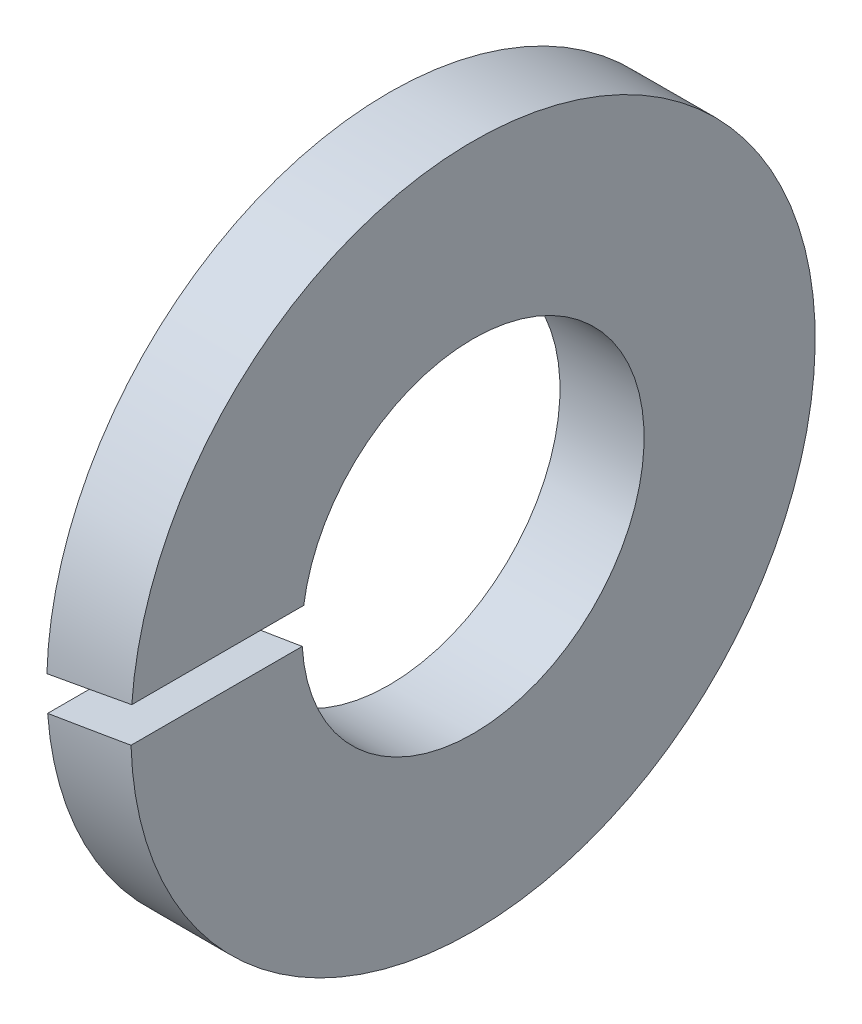
ISO-10303-21;
HEADER;
FILE_DESCRIPTION(('STEP AP214'),'2;1');
FILE_NAME('part.step','',(''),(''),'','','');
FILE_SCHEMA(('AUTOMOTIVE_DESIGN { 1 0 10303 214 1 1 1 1 }'));
ENDSEC;
DATA;
#1=APPLICATION_CONTEXT('core data for automotive mechanical design processes');
#2=APPLICATION_PROTOCOL_DEFINITION('international standard','automotive_design',2000,#1);
#3=PRODUCT_CONTEXT('',#1,'mechanical');
#4=PRODUCT('Part','Part','',(#3));
#5=PRODUCT_RELATED_PRODUCT_CATEGORY('part','',(#4));
#6=PRODUCT_DEFINITION_FORMATION('','',#4);
#7=PRODUCT_DEFINITION_CONTEXT('part definition',#1,'design');
#8=PRODUCT_DEFINITION('design','',#6,#7);
#9=PRODUCT_DEFINITION_SHAPE('','',#8);
#10=(LENGTH_UNIT() NAMED_UNIT(*) SI_UNIT(.MILLI.,.METRE.));
#11=(NAMED_UNIT(*) PLANE_ANGLE_UNIT() SI_UNIT($,.RADIAN.));
#12=(NAMED_UNIT(*) SI_UNIT($,.STERADIAN.) SOLID_ANGLE_UNIT());
#13=UNCERTAINTY_MEASURE_WITH_UNIT(LENGTH_MEASURE(1.E-05),#10,'distance_accuracy_value','');
#14=(GEOMETRIC_REPRESENTATION_CONTEXT(3) GLOBAL_UNCERTAINTY_ASSIGNED_CONTEXT((#13)) GLOBAL_UNIT_ASSIGNED_CONTEXT((#10,
#11,#12)) REPRESENTATION_CONTEXT('',''));
#15=CARTESIAN_POINT('',(0.,0.,0.));
#16=DIRECTION('',(0.,0.,1.));
#17=DIRECTION('',(1.,0.,0.));
#18=AXIS2_PLACEMENT_3D('',#15,#16,#17);
#19=CARTESIAN_POINT('',(-0.75,4.575,0.));
#20=DIRECTION('',(-1.,0.,0.));
#21=DIRECTION('',(0.,0.,1.));
#22=AXIS2_PLACEMENT_3D('',#19,#20,#21);
#23=PLANE('',#22);
#24=DIRECTION('',(0.,0.,1.));
#25=VECTOR('',#24,1.);
#26=CARTESIAN_POINT('',(-0.750000000000001,-0.441950352156501,0.));
#27=LINE('',#26,#25);
#28=CARTESIAN_POINT('',(-0.75,-0.441950352156501,6.08396908984823));
#29=VERTEX_POINT('',#28);
#30=CARTESIAN_POINT('',(-0.75,-0.441950352156501,3.01781044570873));
#31=VERTEX_POINT('',#30);
#32=EDGE_CURVE('E52',#29,#31,#27,.F.);
#33=ORIENTED_EDGE('',*,*,#32,.T.);
#34=CARTESIAN_POINT('',(-0.75,0.,0.));
#35=DIRECTION('',(1.,0.,0.));
#36=DIRECTION('',(0.,0.,-1.));
#37=AXIS2_PLACEMENT_3D('',#34,#35,#36);
#38=CIRCLE('',#37,3.05);
#39=CARTESIAN_POINT('',(-0.75,0.177459881093804,3.04483299880341));
#40=VERTEX_POINT('',#39);
#41=EDGE_CURVE('E19',#31,#40,#38,.T.);
#42=ORIENTED_EDGE('',*,*,#41,.T.);
#43=DIRECTION('',(0.,0.,1.));
#44=VECTOR('',#43,1.);
#45=CARTESIAN_POINT('',(-0.75,0.177459881093804,0.));
#46=LINE('',#45,#44);
#47=CARTESIAN_POINT('',(-0.75,0.177459881093804,6.09741814136132));
#48=VERTEX_POINT('',#47);
#49=EDGE_CURVE('E56',#40,#48,#46,.T.);
#50=ORIENTED_EDGE('',*,*,#49,.T.);
#51=CARTESIAN_POINT('',(-0.75,0.,0.));
#52=DIRECTION('',(1.,0.,0.));
#53=DIRECTION('',(0.,0.,-1.));
#54=AXIS2_PLACEMENT_3D('',#51,#52,#53);
#55=CIRCLE('',#54,6.1);
#56=EDGE_CURVE('E80',#29,#48,#55,.T.);
#57=ORIENTED_EDGE('',*,*,#56,.F.);
#58=EDGE_LOOP('',(#33,#42,#50,#57));
#59=FACE_BOUND('',#58,.T.);
#60=ADVANCED_FACE('F16',(#59),#23,.T.);
#61=CARTESIAN_POINT('',(-1.53017432370673,0.039894098168328,0.));
#62=DIRECTION('',(-0.17364817766693,0.984807753012208,0.));
#63=DIRECTION('',(-0.984807753012208,-0.17364817766693,0.));
#64=AXIS2_PLACEMENT_3D('',#61,#62,#63);
#65=PLANE('',#64);
#66=CARTESIAN_POINT('',(-1.75642499735881,0.,0.));
#67=DIRECTION('',(-0.17364817766693,0.984807753012208,0.));
#68=DIRECTION('',(0.984807753012208,0.17364817766693,0.));
#69=AXIS2_PLACEMENT_3D('',#66,#67,#68);
#70=ELLIPSE('',#69,35.1284999471762,6.1);
#71=CARTESIAN_POINT('',(0.75,0.441950352156501,6.08396908984823));
#72=VERTEX_POINT('',#71);
#73=EDGE_CURVE('E68',#48,#72,#70,.T.);
#74=ORIENTED_EDGE('',*,*,#73,.F.);
#75=ORIENTED_EDGE('',*,*,#49,.F.);
#76=CARTESIAN_POINT('',(-1.75642499735881,0.,0.));
#77=DIRECTION('',(-0.17364817766693,0.984807753012208,0.));
#78=DIRECTION('',(0.984807753012208,0.17364817766693,0.));
#79=AXIS2_PLACEMENT_3D('',#76,#77,#78);
#80=ELLIPSE('',#79,17.5642499735881,3.05);
#81=CARTESIAN_POINT('',(0.75,0.441950352156501,3.01781044570873));
#82=VERTEX_POINT('',#81);
#83=EDGE_CURVE('E62',#40,#82,#80,.T.);
#84=ORIENTED_EDGE('',*,*,#83,.T.);
#85=DIRECTION('',(0.,0.,-1.));
#86=VECTOR('',#85,1.);
#87=CARTESIAN_POINT('',(0.75,0.441950352156501,0.));
#88=LINE('',#87,#86);
#89=EDGE_CURVE('E84',#72,#82,#88,.T.);
#90=ORIENTED_EDGE('',*,*,#89,.F.);
#91=EDGE_LOOP('',(#74,#75,#84,#90));
#92=FACE_BOUND('',#91,.T.);
#93=ADVANCED_FACE('F64',(#92),#65,.F.);
#94=CARTESIAN_POINT('',(0.,0.,0.));
#95=DIRECTION('',(1.,0.,0.));
#96=DIRECTION('',(0.,0.,-1.));
#97=AXIS2_PLACEMENT_3D('',#94,#95,#96);
#98=CYLINDRICAL_SURFACE('',#97,3.05);
#99=ORIENTED_EDGE('',*,*,#83,.F.);
#100=ORIENTED_EDGE('',*,*,#41,.F.);
#101=CARTESIAN_POINT('',(1.75642499735881,0.,0.));
#102=DIRECTION('',(0.17364817766693,-0.984807753012208,0.));
#103=DIRECTION('',(0.984807753012208,0.17364817766693,0.));
#104=AXIS2_PLACEMENT_3D('',#101,#102,#103);
#105=ELLIPSE('',#104,17.5642499735881,3.05);
#106=CARTESIAN_POINT('',(0.75,-0.177459881093804,3.04483299880341));
#107=VERTEX_POINT('',#106);
#108=EDGE_CURVE('E75',#31,#107,#105,.F.);
#109=ORIENTED_EDGE('',*,*,#108,.T.);
#110=CARTESIAN_POINT('',(0.75,0.,0.));
#111=DIRECTION('',(1.,0.,0.));
#112=DIRECTION('',(0.,0.,-1.));
#113=AXIS2_PLACEMENT_3D('',#110,#111,#112);
#114=CIRCLE('',#113,3.05);
#115=EDGE_CURVE('E73',#82,#107,#114,.F.);
#116=ORIENTED_EDGE('',*,*,#115,.F.);
#117=EDGE_LOOP('',(#99,#100,#109,#116));
#118=FACE_BOUND('',#117,.T.);
#119=ADVANCED_FACE('F71',(#118),#98,.F.);
#120=CARTESIAN_POINT('',(1.53017432370673,-0.039894098168328,0.));
#121=DIRECTION('',(0.17364817766693,-0.984807753012208,0.));
#122=DIRECTION('',(0.984807753012208,0.17364817766693,0.));
#123=AXIS2_PLACEMENT_3D('',#120,#121,#122);
#124=PLANE('',#123);
#125=ORIENTED_EDGE('',*,*,#108,.F.);
#126=ORIENTED_EDGE('',*,*,#32,.F.);
#127=CARTESIAN_POINT('',(1.75642499735881,0.,0.));
#128=DIRECTION('',(0.17364817766693,-0.984807753012208,0.));
#129=DIRECTION('',(0.984807753012208,0.17364817766693,0.));
#130=AXIS2_PLACEMENT_3D('',#127,#128,#129);
#131=ELLIPSE('',#130,35.1284999471762,6.1);
#132=CARTESIAN_POINT('',(0.75,-0.177459881093804,6.09741814136132));
#133=VERTEX_POINT('',#132);
#134=EDGE_CURVE('E34',#133,#29,#131,.T.);
#135=ORIENTED_EDGE('',*,*,#134,.F.);
#136=DIRECTION('',(0.,0.,-1.));
#137=VECTOR('',#136,1.);
#138=CARTESIAN_POINT('',(0.75,-0.177459881093804,0.));
#139=LINE('',#138,#137);
#140=EDGE_CURVE('E25',#107,#133,#139,.F.);
#141=ORIENTED_EDGE('',*,*,#140,.F.);
#142=EDGE_LOOP('',(#125,#126,#135,#141));
#143=FACE_BOUND('',#142,.T.);
#144=ADVANCED_FACE('F91',(#143),#124,.F.);
#145=CARTESIAN_POINT('',(0.,0.,0.));
#146=DIRECTION('',(1.,0.,0.));
#147=DIRECTION('',(0.,0.,-1.));
#148=AXIS2_PLACEMENT_3D('',#145,#146,#147);
#149=CYLINDRICAL_SURFACE('',#148,6.1);
#150=ORIENTED_EDGE('',*,*,#56,.T.);
#151=ORIENTED_EDGE('',*,*,#73,.T.);
#152=CARTESIAN_POINT('',(0.75,0.,0.));
#153=DIRECTION('',(1.,0.,0.));
#154=DIRECTION('',(0.,0.,-1.));
#155=AXIS2_PLACEMENT_3D('',#152,#153,#154);
#156=CIRCLE('',#155,6.1);
#157=EDGE_CURVE('E11',#133,#72,#156,.T.);
#158=ORIENTED_EDGE('',*,*,#157,.F.);
#159=ORIENTED_EDGE('',*,*,#134,.T.);
#160=EDGE_LOOP('',(#150,#151,#158,#159));
#161=FACE_BOUND('',#160,.T.);
#162=ADVANCED_FACE('F93',(#161),#149,.T.);
#163=CARTESIAN_POINT('',(0.75,4.575,0.));
#164=DIRECTION('',(1.,0.,0.));
#165=DIRECTION('',(0.,0.,-1.));
#166=AXIS2_PLACEMENT_3D('',#163,#164,#165);
#167=PLANE('',#166);
#168=ORIENTED_EDGE('',*,*,#140,.T.);
#169=ORIENTED_EDGE('',*,*,#157,.T.);
#170=ORIENTED_EDGE('',*,*,#89,.T.);
#171=ORIENTED_EDGE('',*,*,#115,.T.);
#172=EDGE_LOOP('',(#168,#169,#170,#171));
#173=FACE_BOUND('',#172,.T.);
#174=ADVANCED_FACE('F90',(#173),#167,.T.);
#175=CLOSED_SHELL('',(#60,#93,#119,#144,#162,#174));
#176=MANIFOLD_SOLID_BREP('B1',#175);
#177=ADVANCED_BREP_SHAPE_REPRESENTATION('',(#18,#176),#14);
#178=SHAPE_DEFINITION_REPRESENTATION(#9,#177);
ENDSEC;
END-ISO-10303-21;
